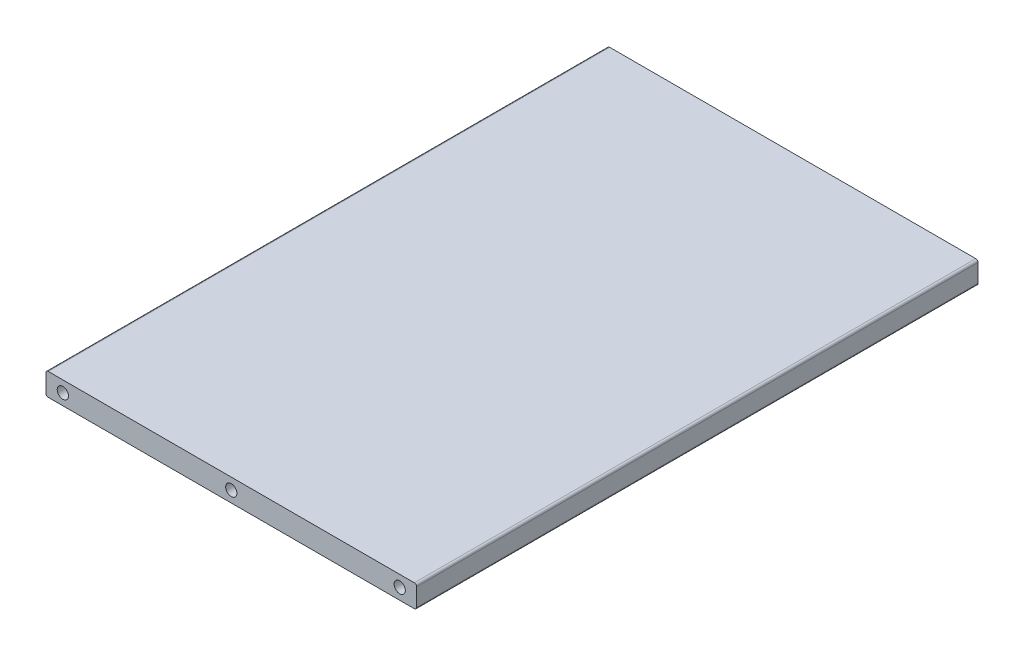
ISO-10303-21;
HEADER;
FILE_DESCRIPTION(('STEP AP214'),'2;1');
FILE_NAME('part.step','',(''),(''),'','','');
FILE_SCHEMA(('AUTOMOTIVE_DESIGN { 1 0 10303 214 1 1 1 1 }'));
ENDSEC;
DATA;
#1=APPLICATION_CONTEXT('core data for automotive mechanical design processes');
#2=APPLICATION_PROTOCOL_DEFINITION('international standard','automotive_design',2000,#1);
#3=PRODUCT_CONTEXT('',#1,'mechanical');
#4=PRODUCT('Part','Part','',(#3));
#5=PRODUCT_RELATED_PRODUCT_CATEGORY('part','',(#4));
#6=PRODUCT_DEFINITION_FORMATION('','',#4);
#7=PRODUCT_DEFINITION_CONTEXT('part definition',#1,'design');
#8=PRODUCT_DEFINITION('design','',#6,#7);
#9=PRODUCT_DEFINITION_SHAPE('','',#8);
#10=(LENGTH_UNIT() NAMED_UNIT(*) SI_UNIT(.MILLI.,.METRE.));
#11=(NAMED_UNIT(*) PLANE_ANGLE_UNIT() SI_UNIT($,.RADIAN.));
#12=(NAMED_UNIT(*) SI_UNIT($,.STERADIAN.) SOLID_ANGLE_UNIT());
#13=UNCERTAINTY_MEASURE_WITH_UNIT(LENGTH_MEASURE(1.E-05),#10,'distance_accuracy_value','');
#14=(GEOMETRIC_REPRESENTATION_CONTEXT(3) GLOBAL_UNCERTAINTY_ASSIGNED_CONTEXT((#13)) GLOBAL_UNIT_ASSIGNED_CONTEXT((#10,
#11,#12)) REPRESENTATION_CONTEXT('',''));
#15=CARTESIAN_POINT('',(0.,0.,0.));
#16=DIRECTION('',(0.,0.,1.));
#17=DIRECTION('',(1.,0.,0.));
#18=AXIS2_PLACEMENT_3D('',#15,#16,#17);
#19=CARTESIAN_POINT('',(165.,20.,250.));
#20=DIRECTION('',(-1.,0.,0.));
#21=DIRECTION('',(0.,0.,1.));
#22=AXIS2_PLACEMENT_3D('',#19,#20,#21);
#23=PLANE('',#22);
#24=DIRECTION('',(0.,-1.,0.));
#25=VECTOR('',#24,1.);
#26=CARTESIAN_POINT('',(165.,20.,250.));
#27=LINE('',#26,#25);
#28=CARTESIAN_POINT('',(165.,18.,250.));
#29=VERTEX_POINT('',#28);
#30=CARTESIAN_POINT('',(165.,2.,250.));
#31=VERTEX_POINT('',#30);
#32=EDGE_CURVE('E130',#29,#31,#27,.T.);
#33=ORIENTED_EDGE('',*,*,#32,.T.);
#34=DIRECTION('',(0.,0.,-1.));
#35=VECTOR('',#34,1.);
#36=CARTESIAN_POINT('',(165.,2.,-250.));
#37=LINE('',#36,#35);
#38=CARTESIAN_POINT('',(165.,2.,-250.));
#39=VERTEX_POINT('',#38);
#40=EDGE_CURVE('E11',#31,#39,#37,.T.);
#41=ORIENTED_EDGE('',*,*,#40,.T.);
#42=DIRECTION('',(0.,-1.,0.));
#43=VECTOR('',#42,1.);
#44=CARTESIAN_POINT('',(165.,20.,-250.));
#45=LINE('',#44,#43);
#46=CARTESIAN_POINT('',(165.,18.,-250.));
#47=VERTEX_POINT('',#46);
#48=EDGE_CURVE('E136',#47,#39,#45,.T.);
#49=ORIENTED_EDGE('',*,*,#48,.F.);
#50=DIRECTION('',(0.,0.,-1.));
#51=VECTOR('',#50,1.);
#52=CARTESIAN_POINT('',(165.,18.,250.));
#53=LINE('',#52,#51);
#54=EDGE_CURVE('E48',#47,#29,#53,.F.);
#55=ORIENTED_EDGE('',*,*,#54,.T.);
#56=EDGE_LOOP('',(#33,#41,#49,#55));
#57=FACE_BOUND('',#56,.T.);
#58=ADVANCED_FACE('F39',(#57),#23,.F.);
#59=CARTESIAN_POINT('',(-165.,20.,-250.));
#60=DIRECTION('',(0.,0.,1.));
#61=DIRECTION('',(1.,0.,0.));
#62=AXIS2_PLACEMENT_3D('',#59,#60,#61);
#63=PLANE('',#62);
#64=CARTESIAN_POINT('',(150.,10.,-250.));
#65=DIRECTION('',(0.,0.,1.));
#66=DIRECTION('',(1.,0.,0.));
#67=AXIS2_PLACEMENT_3D('',#64,#65,#66);
#68=CIRCLE('',#67,4.99999999999999);
#69=CARTESIAN_POINT('',(155.,10.,-250.));
#70=VERTEX_POINT('',#69);
#71=EDGE_CURVE('E347',#70,#70,#68,.T.);
#72=ORIENTED_EDGE('',*,*,#71,.T.);
#73=EDGE_LOOP('',(#72));
#74=FACE_BOUND('',#73,.T.);
#75=CARTESIAN_POINT('',(-150.,10.,-250.));
#76=DIRECTION('',(0.,0.,1.));
#77=DIRECTION('',(1.,0.,0.));
#78=AXIS2_PLACEMENT_3D('',#75,#76,#77);
#79=CIRCLE('',#78,4.99999999999999);
#80=CARTESIAN_POINT('',(-145.,10.,-250.));
#81=VERTEX_POINT('',#80);
#82=EDGE_CURVE('E338',#81,#81,#79,.T.);
#83=ORIENTED_EDGE('',*,*,#82,.T.);
#84=EDGE_LOOP('',(#83));
#85=FACE_BOUND('',#84,.T.);
#86=CARTESIAN_POINT('',(0.,10.,-250.));
#87=DIRECTION('',(0.,0.,1.));
#88=DIRECTION('',(1.,0.,0.));
#89=AXIS2_PLACEMENT_3D('',#86,#87,#88);
#90=CIRCLE('',#89,5.);
#91=CARTESIAN_POINT('',(4.99999999999997,10.,-250.));
#92=VERTEX_POINT('',#91);
#93=EDGE_CURVE('E203',#92,#92,#90,.T.);
#94=ORIENTED_EDGE('',*,*,#93,.T.);
#95=EDGE_LOOP('',(#94));
#96=FACE_BOUND('',#95,.T.);
#97=DIRECTION('',(-1.,0.,0.));
#98=VECTOR('',#97,1.);
#99=CARTESIAN_POINT('',(-165.,0.,-250.));
#100=LINE('',#99,#98);
#101=CARTESIAN_POINT('',(163.,0.,-250.));
#102=VERTEX_POINT('',#101);
#103=CARTESIAN_POINT('',(-163.,0.,-250.));
#104=VERTEX_POINT('',#103);
#105=EDGE_CURVE('E196',#102,#104,#100,.T.);
#106=ORIENTED_EDGE('',*,*,#105,.T.);
#107=CARTESIAN_POINT('',(-163.,2.,-250.));
#108=DIRECTION('',(0.,0.,1.));
#109=DIRECTION('',(1.,0.,0.));
#110=AXIS2_PLACEMENT_3D('',#107,#108,#109);
#111=CIRCLE('',#110,2.);
#112=CARTESIAN_POINT('',(-165.,2.,-250.));
#113=VERTEX_POINT('',#112);
#114=EDGE_CURVE('E163',#104,#113,#111,.F.);
#115=ORIENTED_EDGE('',*,*,#114,.T.);
#116=DIRECTION('',(0.,-1.,0.));
#117=VECTOR('',#116,1.);
#118=CARTESIAN_POINT('',(-165.,20.,-250.));
#119=LINE('',#118,#117);
#120=CARTESIAN_POINT('',(-165.,18.,-250.));
#121=VERTEX_POINT('',#120);
#122=EDGE_CURVE('E129',#121,#113,#119,.T.);
#123=ORIENTED_EDGE('',*,*,#122,.F.);
#124=CARTESIAN_POINT('',(-163.,18.,-250.));
#125=DIRECTION('',(0.,0.,1.));
#126=DIRECTION('',(1.,0.,0.));
#127=AXIS2_PLACEMENT_3D('',#124,#125,#126);
#128=CIRCLE('',#127,2.);
#129=CARTESIAN_POINT('',(-163.,20.,-250.));
#130=VERTEX_POINT('',#129);
#131=EDGE_CURVE('E134',#121,#130,#128,.F.);
#132=ORIENTED_EDGE('',*,*,#131,.T.);
#133=DIRECTION('',(-1.,0.,0.));
#134=VECTOR('',#133,1.);
#135=CARTESIAN_POINT('',(-165.,20.,-250.));
#136=LINE('',#135,#134);
#137=CARTESIAN_POINT('',(163.,20.,-250.));
#138=VERTEX_POINT('',#137);
#139=EDGE_CURVE('E187',#138,#130,#136,.T.);
#140=ORIENTED_EDGE('',*,*,#139,.F.);
#141=CARTESIAN_POINT('',(163.,18.,-250.));
#142=DIRECTION('',(0.,0.,1.));
#143=DIRECTION('',(1.,0.,0.));
#144=AXIS2_PLACEMENT_3D('',#141,#142,#143);
#145=CIRCLE('',#144,2.);
#146=EDGE_CURVE('E62',#138,#47,#145,.F.);
#147=ORIENTED_EDGE('',*,*,#146,.T.);
#148=ORIENTED_EDGE('',*,*,#48,.T.);
#149=CARTESIAN_POINT('',(163.,2.,-250.));
#150=DIRECTION('',(0.,0.,1.));
#151=DIRECTION('',(1.,0.,0.));
#152=AXIS2_PLACEMENT_3D('',#149,#150,#151);
#153=CIRCLE('',#152,2.);
#154=EDGE_CURVE('E55',#39,#102,#153,.F.);
#155=ORIENTED_EDGE('',*,*,#154,.T.);
#156=EDGE_LOOP('',(#106,#115,#123,#132,#140,#147,#148,#155));
#157=FACE_BOUND('',#156,.T.);
#158=ADVANCED_FACE('F189',(#74,#85,#96,#157),#63,.F.);
#159=CARTESIAN_POINT('',(-165.,20.,250.));
#160=DIRECTION('',(1.,0.,0.));
#161=DIRECTION('',(0.,0.,-1.));
#162=AXIS2_PLACEMENT_3D('',#159,#160,#161);
#163=PLANE('',#162);
#164=ORIENTED_EDGE('',*,*,#122,.T.);
#165=DIRECTION('',(0.,0.,1.));
#166=VECTOR('',#165,1.);
#167=CARTESIAN_POINT('',(-165.,2.,250.));
#168=LINE('',#167,#166);
#169=CARTESIAN_POINT('',(-165.,2.,250.));
#170=VERTEX_POINT('',#169);
#171=EDGE_CURVE('E127',#113,#170,#168,.T.);
#172=ORIENTED_EDGE('',*,*,#171,.T.);
#173=DIRECTION('',(0.,-1.,0.));
#174=VECTOR('',#173,1.);
#175=CARTESIAN_POINT('',(-165.,20.,250.));
#176=LINE('',#175,#174);
#177=CARTESIAN_POINT('',(-165.,18.,250.));
#178=VERTEX_POINT('',#177);
#179=EDGE_CURVE('E109',#178,#170,#176,.T.);
#180=ORIENTED_EDGE('',*,*,#179,.F.);
#181=DIRECTION('',(0.,0.,1.));
#182=VECTOR('',#181,1.);
#183=CARTESIAN_POINT('',(-165.,18.,250.));
#184=LINE('',#183,#182);
#185=EDGE_CURVE('E124',#178,#121,#184,.F.);
#186=ORIENTED_EDGE('',*,*,#185,.T.);
#187=EDGE_LOOP('',(#164,#172,#180,#186));
#188=FACE_BOUND('',#187,.T.);
#189=ADVANCED_FACE('F123',(#188),#163,.F.);
#190=CARTESIAN_POINT('',(-165.,20.,250.));
#191=DIRECTION('',(0.,0.,-1.));
#192=DIRECTION('',(-1.,0.,0.));
#193=AXIS2_PLACEMENT_3D('',#190,#191,#192);
#194=PLANE('',#193);
#195=CARTESIAN_POINT('',(150.,10.,250.));
#196=DIRECTION('',(0.,0.,1.));
#197=DIRECTION('',(1.,0.,0.));
#198=AXIS2_PLACEMENT_3D('',#195,#196,#197);
#199=CIRCLE('',#198,4.99999999999999);
#200=CARTESIAN_POINT('',(155.,10.,250.));
#201=VERTEX_POINT('',#200);
#202=EDGE_CURVE('E329',#201,#201,#199,.T.);
#203=ORIENTED_EDGE('',*,*,#202,.F.);
#204=EDGE_LOOP('',(#203));
#205=FACE_BOUND('',#204,.T.);
#206=CARTESIAN_POINT('',(-150.,10.,250.));
#207=DIRECTION('',(0.,0.,1.));
#208=DIRECTION('',(1.,0.,0.));
#209=AXIS2_PLACEMENT_3D('',#206,#207,#208);
#210=CIRCLE('',#209,4.99999999999999);
#211=CARTESIAN_POINT('',(-145.,10.,250.));
#212=VERTEX_POINT('',#211);
#213=EDGE_CURVE('E333',#212,#212,#210,.T.);
#214=ORIENTED_EDGE('',*,*,#213,.F.);
#215=EDGE_LOOP('',(#214));
#216=FACE_BOUND('',#215,.T.);
#217=CARTESIAN_POINT('',(0.,10.,250.));
#218=DIRECTION('',(0.,0.,1.));
#219=DIRECTION('',(1.,0.,0.));
#220=AXIS2_PLACEMENT_3D('',#217,#218,#219);
#221=CIRCLE('',#220,5.);
#222=CARTESIAN_POINT('',(4.99999999999997,10.,250.));
#223=VERTEX_POINT('',#222);
#224=EDGE_CURVE('E199',#223,#223,#221,.T.);
#225=ORIENTED_EDGE('',*,*,#224,.F.);
#226=EDGE_LOOP('',(#225));
#227=FACE_BOUND('',#226,.T.);
#228=ORIENTED_EDGE('',*,*,#179,.T.);
#229=CARTESIAN_POINT('',(-163.,2.,250.));
#230=DIRECTION('',(0.,0.,-1.));
#231=DIRECTION('',(-1.,0.,0.));
#232=AXIS2_PLACEMENT_3D('',#229,#230,#231);
#233=CIRCLE('',#232,2.);
#234=CARTESIAN_POINT('',(-163.,0.,250.));
#235=VERTEX_POINT('',#234);
#236=EDGE_CURVE('E117',#170,#235,#233,.F.);
#237=ORIENTED_EDGE('',*,*,#236,.T.);
#238=DIRECTION('',(1.,0.,0.));
#239=VECTOR('',#238,1.);
#240=CARTESIAN_POINT('',(-165.,0.,250.));
#241=LINE('',#240,#239);
#242=CARTESIAN_POINT('',(163.,0.,250.));
#243=VERTEX_POINT('',#242);
#244=EDGE_CURVE('E191',#235,#243,#241,.T.);
#245=ORIENTED_EDGE('',*,*,#244,.T.);
#246=CARTESIAN_POINT('',(163.,2.,250.));
#247=DIRECTION('',(0.,0.,-1.));
#248=DIRECTION('',(-1.,0.,0.));
#249=AXIS2_PLACEMENT_3D('',#246,#247,#248);
#250=CIRCLE('',#249,2.);
#251=EDGE_CURVE('E118',#243,#31,#250,.F.);
#252=ORIENTED_EDGE('',*,*,#251,.T.);
#253=ORIENTED_EDGE('',*,*,#32,.F.);
#254=CARTESIAN_POINT('',(163.,18.,250.));
#255=DIRECTION('',(0.,0.,-1.));
#256=DIRECTION('',(-1.,0.,0.));
#257=AXIS2_PLACEMENT_3D('',#254,#255,#256);
#258=CIRCLE('',#257,2.);
#259=CARTESIAN_POINT('',(163.,20.,250.));
#260=VERTEX_POINT('',#259);
#261=EDGE_CURVE('E140',#29,#260,#258,.F.);
#262=ORIENTED_EDGE('',*,*,#261,.T.);
#263=DIRECTION('',(1.,0.,0.));
#264=VECTOR('',#263,1.);
#265=CARTESIAN_POINT('',(-165.,20.,250.));
#266=LINE('',#265,#264);
#267=CARTESIAN_POINT('',(-163.,20.,250.));
#268=VERTEX_POINT('',#267);
#269=EDGE_CURVE('E111',#268,#260,#266,.T.);
#270=ORIENTED_EDGE('',*,*,#269,.F.);
#271=CARTESIAN_POINT('',(-163.,18.,250.));
#272=DIRECTION('',(0.,0.,-1.));
#273=DIRECTION('',(-1.,0.,0.));
#274=AXIS2_PLACEMENT_3D('',#271,#272,#273);
#275=CIRCLE('',#274,2.);
#276=EDGE_CURVE('E106',#268,#178,#275,.F.);
#277=ORIENTED_EDGE('',*,*,#276,.T.);
#278=EDGE_LOOP('',(#228,#237,#245,#252,#253,#262,#270,#277));
#279=FACE_BOUND('',#278,.T.);
#280=ADVANCED_FACE('F108',(#205,#216,#227,#279),#194,.F.);
#281=CARTESIAN_POINT('',(0.,20.,0.));
#282=DIRECTION('',(0.,-1.,0.));
#283=DIRECTION('',(0.,0.,-1.));
#284=AXIS2_PLACEMENT_3D('',#281,#282,#283);
#285=PLANE('',#284);
#286=ORIENTED_EDGE('',*,*,#139,.T.);
#287=DIRECTION('',(0.,0.,1.));
#288=VECTOR('',#287,1.);
#289=CARTESIAN_POINT('',(-163.,20.,0.));
#290=LINE('',#289,#288);
#291=EDGE_CURVE('E170',#130,#268,#290,.T.);
#292=ORIENTED_EDGE('',*,*,#291,.T.);
#293=ORIENTED_EDGE('',*,*,#269,.T.);
#294=DIRECTION('',(0.,0.,-1.));
#295=VECTOR('',#294,1.);
#296=CARTESIAN_POINT('',(163.,20.,0.));
#297=LINE('',#296,#295);
#298=EDGE_CURVE('E166',#260,#138,#297,.T.);
#299=ORIENTED_EDGE('',*,*,#298,.T.);
#300=EDGE_LOOP('',(#286,#292,#293,#299));
#301=FACE_BOUND('',#300,.T.);
#302=ADVANCED_FACE('F186',(#301),#285,.F.);
#303=CARTESIAN_POINT('',(0.,0.,0.));
#304=DIRECTION('',(0.,-1.,0.));
#305=DIRECTION('',(0.,0.,-1.));
#306=AXIS2_PLACEMENT_3D('',#303,#304,#305);
#307=PLANE('',#306);
#308=ORIENTED_EDGE('',*,*,#244,.F.);
#309=DIRECTION('',(0.,0.,1.));
#310=VECTOR('',#309,1.);
#311=CARTESIAN_POINT('',(-163.,0.,-250.));
#312=LINE('',#311,#310);
#313=EDGE_CURVE('E154',#235,#104,#312,.F.);
#314=ORIENTED_EDGE('',*,*,#313,.T.);
#315=ORIENTED_EDGE('',*,*,#105,.F.);
#316=DIRECTION('',(0.,0.,-1.));
#317=VECTOR('',#316,1.);
#318=CARTESIAN_POINT('',(163.,0.,250.));
#319=LINE('',#318,#317);
#320=EDGE_CURVE('E151',#102,#243,#319,.F.);
#321=ORIENTED_EDGE('',*,*,#320,.T.);
#322=EDGE_LOOP('',(#308,#314,#315,#321));
#323=FACE_BOUND('',#322,.T.);
#324=ADVANCED_FACE('F211',(#323),#307,.T.);
#325=CARTESIAN_POINT('',(0.,10.,-250.));
#326=DIRECTION('',(0.,0.,1.));
#327=DIRECTION('',(1.,0.,0.));
#328=AXIS2_PLACEMENT_3D('',#325,#326,#327);
#329=CYLINDRICAL_SURFACE('',#328,5.);
#330=ORIENTED_EDGE('',*,*,#93,.F.);
#331=EDGE_LOOP('',(#330));
#332=FACE_BOUND('',#331,.T.);
#333=ORIENTED_EDGE('',*,*,#224,.T.);
#334=EDGE_LOOP('',(#333));
#335=FACE_BOUND('',#334,.T.);
#336=ADVANCED_FACE('F240',(#332,#335),#329,.F.);
#337=CARTESIAN_POINT('',(-150.,10.,-250.));
#338=DIRECTION('',(0.,0.,1.));
#339=DIRECTION('',(1.,0.,0.));
#340=AXIS2_PLACEMENT_3D('',#337,#338,#339);
#341=CYLINDRICAL_SURFACE('',#340,4.99999999999999);
#342=ORIENTED_EDGE('',*,*,#82,.F.);
#343=EDGE_LOOP('',(#342));
#344=FACE_BOUND('',#343,.T.);
#345=ORIENTED_EDGE('',*,*,#213,.T.);
#346=EDGE_LOOP('',(#345));
#347=FACE_BOUND('',#346,.T.);
#348=ADVANCED_FACE('F234',(#344,#347),#341,.F.);
#349=CARTESIAN_POINT('',(150.,10.,-250.));
#350=DIRECTION('',(0.,0.,1.));
#351=DIRECTION('',(1.,0.,0.));
#352=AXIS2_PLACEMENT_3D('',#349,#350,#351);
#353=CYLINDRICAL_SURFACE('',#352,4.99999999999999);
#354=ORIENTED_EDGE('',*,*,#71,.F.);
#355=EDGE_LOOP('',(#354));
#356=FACE_BOUND('',#355,.T.);
#357=ORIENTED_EDGE('',*,*,#202,.T.);
#358=EDGE_LOOP('',(#357));
#359=FACE_BOUND('',#358,.T.);
#360=ADVANCED_FACE('F230',(#356,#359),#353,.F.);
#361=CARTESIAN_POINT('',(-163.,2.,250.));
#362=DIRECTION('',(0.,0.,-1.));
#363=DIRECTION('',(-1.,0.,0.));
#364=AXIS2_PLACEMENT_3D('',#361,#362,#363);
#365=CYLINDRICAL_SURFACE('',#364,2.);
#366=ORIENTED_EDGE('',*,*,#114,.F.);
#367=ORIENTED_EDGE('',*,*,#313,.F.);
#368=ORIENTED_EDGE('',*,*,#236,.F.);
#369=ORIENTED_EDGE('',*,*,#171,.F.);
#370=EDGE_LOOP('',(#366,#367,#368,#369));
#371=FACE_BOUND('',#370,.T.);
#372=ADVANCED_FACE('F207',(#371),#365,.T.);
#373=CARTESIAN_POINT('',(-163.,18.,0.));
#374=DIRECTION('',(0.,0.,1.));
#375=DIRECTION('',(1.,0.,0.));
#376=AXIS2_PLACEMENT_3D('',#373,#374,#375);
#377=CYLINDRICAL_SURFACE('',#376,2.);
#378=ORIENTED_EDGE('',*,*,#131,.F.);
#379=ORIENTED_EDGE('',*,*,#185,.F.);
#380=ORIENTED_EDGE('',*,*,#276,.F.);
#381=ORIENTED_EDGE('',*,*,#291,.F.);
#382=EDGE_LOOP('',(#378,#379,#380,#381));
#383=FACE_BOUND('',#382,.T.);
#384=ADVANCED_FACE('F133',(#383),#377,.T.);
#385=CARTESIAN_POINT('',(163.,2.,250.));
#386=DIRECTION('',(0.,0.,1.));
#387=DIRECTION('',(1.,0.,0.));
#388=AXIS2_PLACEMENT_3D('',#385,#386,#387);
#389=CYLINDRICAL_SURFACE('',#388,2.);
#390=ORIENTED_EDGE('',*,*,#251,.F.);
#391=ORIENTED_EDGE('',*,*,#320,.F.);
#392=ORIENTED_EDGE('',*,*,#154,.F.);
#393=ORIENTED_EDGE('',*,*,#40,.F.);
#394=EDGE_LOOP('',(#390,#391,#392,#393));
#395=FACE_BOUND('',#394,.T.);
#396=ADVANCED_FACE('F213',(#395),#389,.T.);
#397=CARTESIAN_POINT('',(163.,18.,0.));
#398=DIRECTION('',(0.,0.,-1.));
#399=DIRECTION('',(-1.,0.,0.));
#400=AXIS2_PLACEMENT_3D('',#397,#398,#399);
#401=CYLINDRICAL_SURFACE('',#400,2.);
#402=ORIENTED_EDGE('',*,*,#261,.F.);
#403=ORIENTED_EDGE('',*,*,#54,.F.);
#404=ORIENTED_EDGE('',*,*,#146,.F.);
#405=ORIENTED_EDGE('',*,*,#298,.F.);
#406=EDGE_LOOP('',(#402,#403,#404,#405));
#407=FACE_BOUND('',#406,.T.);
#408=ADVANCED_FACE('F41',(#407),#401,.T.);
#409=CLOSED_SHELL('',(#58,#158,#189,#280,#302,#324,#336,#348,#360,#372,#384,#396,#408));
#410=MANIFOLD_SOLID_BREP('B2',#409);
#411=ADVANCED_BREP_SHAPE_REPRESENTATION('',(#18,#410),#14);
#412=SHAPE_DEFINITION_REPRESENTATION(#9,#411);
ENDSEC;
END-ISO-10303-21;
